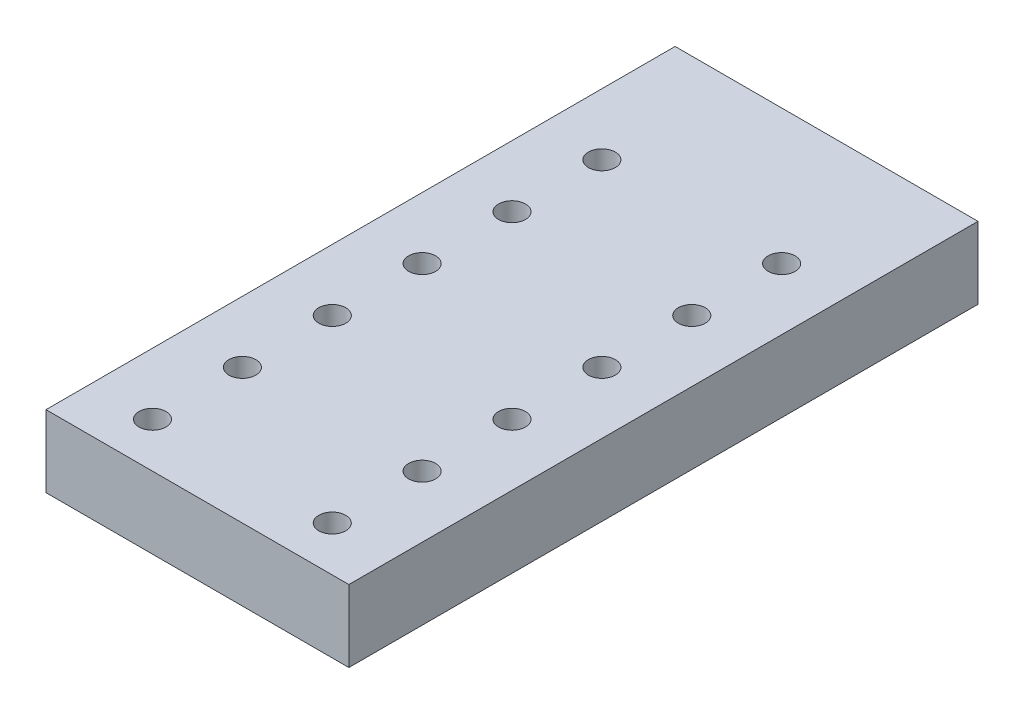
ISO-10303-21;
HEADER;
FILE_DESCRIPTION(('STEP AP214'),'2;1');
FILE_NAME('part.step','',(''),(''),'','','');
FILE_SCHEMA(('AUTOMOTIVE_DESIGN { 1 0 10303 214 1 1 1 1 }'));
ENDSEC;
DATA;
#1=APPLICATION_CONTEXT('core data for automotive mechanical design processes');
#2=APPLICATION_PROTOCOL_DEFINITION('international standard','automotive_design',2000,#1);
#3=PRODUCT_CONTEXT('',#1,'mechanical');
#4=PRODUCT('Part','Part','',(#3));
#5=PRODUCT_RELATED_PRODUCT_CATEGORY('part','',(#4));
#6=PRODUCT_DEFINITION_FORMATION('','',#4);
#7=PRODUCT_DEFINITION_CONTEXT('part definition',#1,'design');
#8=PRODUCT_DEFINITION('design','',#6,#7);
#9=PRODUCT_DEFINITION_SHAPE('','',#8);
#10=(LENGTH_UNIT() NAMED_UNIT(*) SI_UNIT(.MILLI.,.METRE.));
#11=(NAMED_UNIT(*) PLANE_ANGLE_UNIT() SI_UNIT($,.RADIAN.));
#12=(NAMED_UNIT(*) SI_UNIT($,.STERADIAN.) SOLID_ANGLE_UNIT());
#13=UNCERTAINTY_MEASURE_WITH_UNIT(LENGTH_MEASURE(1.E-05),#10,'distance_accuracy_value','');
#14=(GEOMETRIC_REPRESENTATION_CONTEXT(3) GLOBAL_UNCERTAINTY_ASSIGNED_CONTEXT((#13)) GLOBAL_UNIT_ASSIGNED_CONTEXT((#10,
#11,#12)) REPRESENTATION_CONTEXT('',''));
#15=CARTESIAN_POINT('',(0.,0.,0.));
#16=DIRECTION('',(0.,0.,1.));
#17=DIRECTION('',(1.,0.,0.));
#18=AXIS2_PLACEMENT_3D('',#15,#16,#17);
#19=CARTESIAN_POINT('',(10.,4.,65.));
#20=DIRECTION('',(0.,-1.,0.));
#21=DIRECTION('',(0.,0.,-1.));
#22=AXIS2_PLACEMENT_3D('',#19,#20,#21);
#23=CYLINDRICAL_SURFACE('',#22,1.5);
#24=CARTESIAN_POINT('',(10.,4.,65.));
#25=DIRECTION('',(0.,-1.,0.));
#26=DIRECTION('',(0.,0.,-1.));
#27=AXIS2_PLACEMENT_3D('',#24,#25,#26);
#28=CIRCLE('',#27,1.5);
#29=CARTESIAN_POINT('',(10.,4.,63.5));
#30=VERTEX_POINT('',#29);
#31=EDGE_CURVE('E200',#30,#30,#28,.T.);
#32=ORIENTED_EDGE('',*,*,#31,.F.);
#33=EDGE_LOOP('',(#32));
#34=FACE_BOUND('',#33,.T.);
#35=CARTESIAN_POINT('',(10.,0.,65.));
#36=DIRECTION('',(0.,-1.,0.));
#37=DIRECTION('',(0.,0.,-1.));
#38=AXIS2_PLACEMENT_3D('',#35,#36,#37);
#39=CIRCLE('',#38,1.5);
#40=CARTESIAN_POINT('',(10.,0.,63.5));
#41=VERTEX_POINT('',#40);
#42=EDGE_CURVE('E11',#41,#41,#39,.T.);
#43=ORIENTED_EDGE('',*,*,#42,.T.);
#44=EDGE_LOOP('',(#43));
#45=FACE_BOUND('',#44,.T.);
#46=ADVANCED_FACE('F38',(#34,#45),#23,.F.);
#47=CARTESIAN_POINT('',(10.,0.,65.));
#48=DIRECTION('',(0.,-1.,0.));
#49=DIRECTION('',(0.,0.,-1.));
#50=AXIS2_PLACEMENT_3D('',#47,#48,#49);
#51=PLANE('',#50);
#52=ORIENTED_EDGE('',*,*,#42,.F.);
#53=EDGE_LOOP('',(#52));
#54=FACE_BOUND('',#53,.T.);
#55=CARTESIAN_POINT('',(10.,0.,65.));
#56=DIRECTION('',(0.,-1.,0.));
#57=DIRECTION('',(0.,0.,-1.));
#58=AXIS2_PLACEMENT_3D('',#55,#56,#57);
#59=CIRCLE('',#58,2.5);
#60=CARTESIAN_POINT('',(10.,0.,62.5));
#61=VERTEX_POINT('',#60);
#62=EDGE_CURVE('E46',#61,#61,#59,.T.);
#63=ORIENTED_EDGE('',*,*,#62,.T.);
#64=EDGE_LOOP('',(#63));
#65=FACE_BOUND('',#64,.T.);
#66=ADVANCED_FACE('F208',(#54,#65),#51,.T.);
#67=CARTESIAN_POINT('',(10.,0.,65.));
#68=DIRECTION('',(0.,-1.,0.));
#69=DIRECTION('',(0.,0.,-1.));
#70=AXIS2_PLACEMENT_3D('',#67,#68,#69);
#71=CYLINDRICAL_SURFACE('',#70,2.5);
#72=ORIENTED_EDGE('',*,*,#62,.F.);
#73=EDGE_LOOP('',(#72));
#74=FACE_BOUND('',#73,.T.);
#75=CARTESIAN_POINT('',(10.,-4.,65.));
#76=DIRECTION('',(0.,-1.,0.));
#77=DIRECTION('',(0.,0.,-1.));
#78=AXIS2_PLACEMENT_3D('',#75,#76,#77);
#79=CIRCLE('',#78,2.5);
#80=CARTESIAN_POINT('',(10.,-4.,62.5));
#81=VERTEX_POINT('',#80);
#82=EDGE_CURVE('E203',#81,#81,#79,.T.);
#83=ORIENTED_EDGE('',*,*,#82,.T.);
#84=EDGE_LOOP('',(#83));
#85=FACE_BOUND('',#84,.T.);
#86=ADVANCED_FACE('F210',(#74,#85),#71,.F.);
#87=CARTESIAN_POINT('',(10.,4.,55.));
#88=DIRECTION('',(0.,-1.,0.));
#89=DIRECTION('',(0.,0.,-1.));
#90=AXIS2_PLACEMENT_3D('',#87,#88,#89);
#91=CYLINDRICAL_SURFACE('',#90,1.5);
#92=CARTESIAN_POINT('',(10.,4.,55.));
#93=DIRECTION('',(0.,-1.,0.));
#94=DIRECTION('',(0.,0.,-1.));
#95=AXIS2_PLACEMENT_3D('',#92,#93,#94);
#96=CIRCLE('',#95,1.5);
#97=CARTESIAN_POINT('',(10.,4.,53.5));
#98=VERTEX_POINT('',#97);
#99=EDGE_CURVE('E188',#98,#98,#96,.T.);
#100=ORIENTED_EDGE('',*,*,#99,.F.);
#101=EDGE_LOOP('',(#100));
#102=FACE_BOUND('',#101,.T.);
#103=CARTESIAN_POINT('',(10.,0.,55.));
#104=DIRECTION('',(0.,-1.,0.));
#105=DIRECTION('',(0.,0.,-1.));
#106=AXIS2_PLACEMENT_3D('',#103,#104,#105);
#107=CIRCLE('',#106,1.5);
#108=CARTESIAN_POINT('',(10.,0.,53.5));
#109=VERTEX_POINT('',#108);
#110=EDGE_CURVE('E197',#109,#109,#107,.T.);
#111=ORIENTED_EDGE('',*,*,#110,.T.);
#112=EDGE_LOOP('',(#111));
#113=FACE_BOUND('',#112,.T.);
#114=ADVANCED_FACE('F213',(#102,#113),#91,.F.);
#115=CARTESIAN_POINT('',(10.,0.,55.));
#116=DIRECTION('',(0.,-1.,0.));
#117=DIRECTION('',(0.,0.,-1.));
#118=AXIS2_PLACEMENT_3D('',#115,#116,#117);
#119=PLANE('',#118);
#120=ORIENTED_EDGE('',*,*,#110,.F.);
#121=EDGE_LOOP('',(#120));
#122=FACE_BOUND('',#121,.T.);
#123=CARTESIAN_POINT('',(10.,0.,55.));
#124=DIRECTION('',(0.,-1.,0.));
#125=DIRECTION('',(0.,0.,-1.));
#126=AXIS2_PLACEMENT_3D('',#123,#124,#125);
#127=CIRCLE('',#126,2.5);
#128=CARTESIAN_POINT('',(10.,0.,52.5));
#129=VERTEX_POINT('',#128);
#130=EDGE_CURVE('E194',#129,#129,#127,.T.);
#131=ORIENTED_EDGE('',*,*,#130,.T.);
#132=EDGE_LOOP('',(#131));
#133=FACE_BOUND('',#132,.T.);
#134=ADVANCED_FACE('F328',(#122,#133),#119,.T.);
#135=CARTESIAN_POINT('',(10.,0.,55.));
#136=DIRECTION('',(0.,-1.,0.));
#137=DIRECTION('',(0.,0.,-1.));
#138=AXIS2_PLACEMENT_3D('',#135,#136,#137);
#139=CYLINDRICAL_SURFACE('',#138,2.5);
#140=ORIENTED_EDGE('',*,*,#130,.F.);
#141=EDGE_LOOP('',(#140));
#142=FACE_BOUND('',#141,.T.);
#143=CARTESIAN_POINT('',(10.,-4.,55.));
#144=DIRECTION('',(0.,-1.,0.));
#145=DIRECTION('',(0.,0.,-1.));
#146=AXIS2_PLACEMENT_3D('',#143,#144,#145);
#147=CIRCLE('',#146,2.5);
#148=CARTESIAN_POINT('',(10.,-4.,52.5));
#149=VERTEX_POINT('',#148);
#150=EDGE_CURVE('E191',#149,#149,#147,.T.);
#151=ORIENTED_EDGE('',*,*,#150,.T.);
#152=EDGE_LOOP('',(#151));
#153=FACE_BOUND('',#152,.T.);
#154=ADVANCED_FACE('F324',(#142,#153),#139,.F.);
#155=CARTESIAN_POINT('',(10.,4.,45.));
#156=DIRECTION('',(0.,-1.,0.));
#157=DIRECTION('',(0.,0.,-1.));
#158=AXIS2_PLACEMENT_3D('',#155,#156,#157);
#159=CYLINDRICAL_SURFACE('',#158,1.5);
#160=CARTESIAN_POINT('',(10.,4.,45.));
#161=DIRECTION('',(0.,-1.,0.));
#162=DIRECTION('',(0.,0.,-1.));
#163=AXIS2_PLACEMENT_3D('',#160,#161,#162);
#164=CIRCLE('',#163,1.5);
#165=CARTESIAN_POINT('',(10.,4.,43.5));
#166=VERTEX_POINT('',#165);
#167=EDGE_CURVE('E176',#166,#166,#164,.T.);
#168=ORIENTED_EDGE('',*,*,#167,.F.);
#169=EDGE_LOOP('',(#168));
#170=FACE_BOUND('',#169,.T.);
#171=CARTESIAN_POINT('',(10.,0.,45.));
#172=DIRECTION('',(0.,-1.,0.));
#173=DIRECTION('',(0.,0.,-1.));
#174=AXIS2_PLACEMENT_3D('',#171,#172,#173);
#175=CIRCLE('',#174,1.5);
#176=CARTESIAN_POINT('',(10.,0.,43.5));
#177=VERTEX_POINT('',#176);
#178=EDGE_CURVE('E185',#177,#177,#175,.T.);
#179=ORIENTED_EDGE('',*,*,#178,.T.);
#180=EDGE_LOOP('',(#179));
#181=FACE_BOUND('',#180,.T.);
#182=ADVANCED_FACE('F320',(#170,#181),#159,.F.);
#183=CARTESIAN_POINT('',(10.,0.,45.));
#184=DIRECTION('',(0.,-1.,0.));
#185=DIRECTION('',(0.,0.,-1.));
#186=AXIS2_PLACEMENT_3D('',#183,#184,#185);
#187=PLANE('',#186);
#188=ORIENTED_EDGE('',*,*,#178,.F.);
#189=EDGE_LOOP('',(#188));
#190=FACE_BOUND('',#189,.T.);
#191=CARTESIAN_POINT('',(10.,0.,45.));
#192=DIRECTION('',(0.,-1.,0.));
#193=DIRECTION('',(0.,0.,-1.));
#194=AXIS2_PLACEMENT_3D('',#191,#192,#193);
#195=CIRCLE('',#194,2.5);
#196=CARTESIAN_POINT('',(10.,0.,42.5));
#197=VERTEX_POINT('',#196);
#198=EDGE_CURVE('E182',#197,#197,#195,.T.);
#199=ORIENTED_EDGE('',*,*,#198,.T.);
#200=EDGE_LOOP('',(#199));
#201=FACE_BOUND('',#200,.T.);
#202=ADVANCED_FACE('F316',(#190,#201),#187,.T.);
#203=CARTESIAN_POINT('',(10.,0.,45.));
#204=DIRECTION('',(0.,-1.,0.));
#205=DIRECTION('',(0.,0.,-1.));
#206=AXIS2_PLACEMENT_3D('',#203,#204,#205);
#207=CYLINDRICAL_SURFACE('',#206,2.5);
#208=ORIENTED_EDGE('',*,*,#198,.F.);
#209=EDGE_LOOP('',(#208));
#210=FACE_BOUND('',#209,.T.);
#211=CARTESIAN_POINT('',(10.,-4.,45.));
#212=DIRECTION('',(0.,-1.,0.));
#213=DIRECTION('',(0.,0.,-1.));
#214=AXIS2_PLACEMENT_3D('',#211,#212,#213);
#215=CIRCLE('',#214,2.5);
#216=CARTESIAN_POINT('',(10.,-4.,42.5));
#217=VERTEX_POINT('',#216);
#218=EDGE_CURVE('E179',#217,#217,#215,.T.);
#219=ORIENTED_EDGE('',*,*,#218,.T.);
#220=EDGE_LOOP('',(#219));
#221=FACE_BOUND('',#220,.T.);
#222=ADVANCED_FACE('F312',(#210,#221),#207,.F.);
#223=CARTESIAN_POINT('',(10.,4.,35.));
#224=DIRECTION('',(0.,-1.,0.));
#225=DIRECTION('',(0.,0.,-1.));
#226=AXIS2_PLACEMENT_3D('',#223,#224,#225);
#227=CYLINDRICAL_SURFACE('',#226,1.5);
#228=CARTESIAN_POINT('',(10.,4.,35.));
#229=DIRECTION('',(0.,-1.,0.));
#230=DIRECTION('',(0.,0.,-1.));
#231=AXIS2_PLACEMENT_3D('',#228,#229,#230);
#232=CIRCLE('',#231,1.5);
#233=CARTESIAN_POINT('',(10.,4.,33.5));
#234=VERTEX_POINT('',#233);
#235=EDGE_CURVE('E164',#234,#234,#232,.T.);
#236=ORIENTED_EDGE('',*,*,#235,.F.);
#237=EDGE_LOOP('',(#236));
#238=FACE_BOUND('',#237,.T.);
#239=CARTESIAN_POINT('',(10.,0.,35.));
#240=DIRECTION('',(0.,-1.,0.));
#241=DIRECTION('',(0.,0.,-1.));
#242=AXIS2_PLACEMENT_3D('',#239,#240,#241);
#243=CIRCLE('',#242,1.5);
#244=CARTESIAN_POINT('',(10.,0.,33.5));
#245=VERTEX_POINT('',#244);
#246=EDGE_CURVE('E173',#245,#245,#243,.T.);
#247=ORIENTED_EDGE('',*,*,#246,.T.);
#248=EDGE_LOOP('',(#247));
#249=FACE_BOUND('',#248,.T.);
#250=ADVANCED_FACE('F308',(#238,#249),#227,.F.);
#251=CARTESIAN_POINT('',(10.,0.,35.));
#252=DIRECTION('',(0.,-1.,0.));
#253=DIRECTION('',(0.,0.,-1.));
#254=AXIS2_PLACEMENT_3D('',#251,#252,#253);
#255=PLANE('',#254);
#256=ORIENTED_EDGE('',*,*,#246,.F.);
#257=EDGE_LOOP('',(#256));
#258=FACE_BOUND('',#257,.T.);
#259=CARTESIAN_POINT('',(10.,0.,35.));
#260=DIRECTION('',(0.,-1.,0.));
#261=DIRECTION('',(0.,0.,-1.));
#262=AXIS2_PLACEMENT_3D('',#259,#260,#261);
#263=CIRCLE('',#262,2.5);
#264=CARTESIAN_POINT('',(10.,0.,32.5));
#265=VERTEX_POINT('',#264);
#266=EDGE_CURVE('E170',#265,#265,#263,.T.);
#267=ORIENTED_EDGE('',*,*,#266,.T.);
#268=EDGE_LOOP('',(#267));
#269=FACE_BOUND('',#268,.T.);
#270=ADVANCED_FACE('F304',(#258,#269),#255,.T.);
#271=CARTESIAN_POINT('',(10.,0.,35.));
#272=DIRECTION('',(0.,-1.,0.));
#273=DIRECTION('',(0.,0.,-1.));
#274=AXIS2_PLACEMENT_3D('',#271,#272,#273);
#275=CYLINDRICAL_SURFACE('',#274,2.5);
#276=ORIENTED_EDGE('',*,*,#266,.F.);
#277=EDGE_LOOP('',(#276));
#278=FACE_BOUND('',#277,.T.);
#279=CARTESIAN_POINT('',(10.,-4.,35.));
#280=DIRECTION('',(0.,-1.,0.));
#281=DIRECTION('',(0.,0.,-1.));
#282=AXIS2_PLACEMENT_3D('',#279,#280,#281);
#283=CIRCLE('',#282,2.5);
#284=CARTESIAN_POINT('',(10.,-4.,32.5));
#285=VERTEX_POINT('',#284);
#286=EDGE_CURVE('E167',#285,#285,#283,.T.);
#287=ORIENTED_EDGE('',*,*,#286,.T.);
#288=EDGE_LOOP('',(#287));
#289=FACE_BOUND('',#288,.T.);
#290=ADVANCED_FACE('F300',(#278,#289),#275,.F.);
#291=CARTESIAN_POINT('',(-10.,4.,65.));
#292=DIRECTION('',(0.,-1.,0.));
#293=DIRECTION('',(0.,0.,-1.));
#294=AXIS2_PLACEMENT_3D('',#291,#292,#293);
#295=CYLINDRICAL_SURFACE('',#294,1.5);
#296=CARTESIAN_POINT('',(-10.,4.,65.));
#297=DIRECTION('',(0.,-1.,0.));
#298=DIRECTION('',(0.,0.,-1.));
#299=AXIS2_PLACEMENT_3D('',#296,#297,#298);
#300=CIRCLE('',#299,1.5);
#301=CARTESIAN_POINT('',(-10.,4.,63.5));
#302=VERTEX_POINT('',#301);
#303=EDGE_CURVE('E152',#302,#302,#300,.T.);
#304=ORIENTED_EDGE('',*,*,#303,.F.);
#305=EDGE_LOOP('',(#304));
#306=FACE_BOUND('',#305,.T.);
#307=CARTESIAN_POINT('',(-10.,0.,65.));
#308=DIRECTION('',(0.,-1.,0.));
#309=DIRECTION('',(0.,0.,-1.));
#310=AXIS2_PLACEMENT_3D('',#307,#308,#309);
#311=CIRCLE('',#310,1.5);
#312=CARTESIAN_POINT('',(-10.,0.,63.5));
#313=VERTEX_POINT('',#312);
#314=EDGE_CURVE('E161',#313,#313,#311,.T.);
#315=ORIENTED_EDGE('',*,*,#314,.T.);
#316=EDGE_LOOP('',(#315));
#317=FACE_BOUND('',#316,.T.);
#318=ADVANCED_FACE('F296',(#306,#317),#295,.F.);
#319=CARTESIAN_POINT('',(-10.,0.,65.));
#320=DIRECTION('',(0.,-1.,0.));
#321=DIRECTION('',(0.,0.,-1.));
#322=AXIS2_PLACEMENT_3D('',#319,#320,#321);
#323=PLANE('',#322);
#324=ORIENTED_EDGE('',*,*,#314,.F.);
#325=EDGE_LOOP('',(#324));
#326=FACE_BOUND('',#325,.T.);
#327=CARTESIAN_POINT('',(-10.,0.,65.));
#328=DIRECTION('',(0.,-1.,0.));
#329=DIRECTION('',(0.,0.,-1.));
#330=AXIS2_PLACEMENT_3D('',#327,#328,#329);
#331=CIRCLE('',#330,2.5);
#332=CARTESIAN_POINT('',(-10.,0.,62.5));
#333=VERTEX_POINT('',#332);
#334=EDGE_CURVE('E158',#333,#333,#331,.T.);
#335=ORIENTED_EDGE('',*,*,#334,.T.);
#336=EDGE_LOOP('',(#335));
#337=FACE_BOUND('',#336,.T.);
#338=ADVANCED_FACE('F292',(#326,#337),#323,.T.);
#339=CARTESIAN_POINT('',(-10.,0.,65.));
#340=DIRECTION('',(0.,-1.,0.));
#341=DIRECTION('',(0.,0.,-1.));
#342=AXIS2_PLACEMENT_3D('',#339,#340,#341);
#343=CYLINDRICAL_SURFACE('',#342,2.5);
#344=ORIENTED_EDGE('',*,*,#334,.F.);
#345=EDGE_LOOP('',(#344));
#346=FACE_BOUND('',#345,.T.);
#347=CARTESIAN_POINT('',(-10.,-4.,65.));
#348=DIRECTION('',(0.,-1.,0.));
#349=DIRECTION('',(0.,0.,-1.));
#350=AXIS2_PLACEMENT_3D('',#347,#348,#349);
#351=CIRCLE('',#350,2.5);
#352=CARTESIAN_POINT('',(-10.,-4.,62.5));
#353=VERTEX_POINT('',#352);
#354=EDGE_CURVE('E155',#353,#353,#351,.T.);
#355=ORIENTED_EDGE('',*,*,#354,.T.);
#356=EDGE_LOOP('',(#355));
#357=FACE_BOUND('',#356,.T.);
#358=ADVANCED_FACE('F288',(#346,#357),#343,.F.);
#359=CARTESIAN_POINT('',(-10.,4.,55.));
#360=DIRECTION('',(0.,-1.,0.));
#361=DIRECTION('',(0.,0.,-1.));
#362=AXIS2_PLACEMENT_3D('',#359,#360,#361);
#363=CYLINDRICAL_SURFACE('',#362,1.5);
#364=CARTESIAN_POINT('',(-10.,4.,55.));
#365=DIRECTION('',(0.,-1.,0.));
#366=DIRECTION('',(0.,0.,-1.));
#367=AXIS2_PLACEMENT_3D('',#364,#365,#366);
#368=CIRCLE('',#367,1.5);
#369=CARTESIAN_POINT('',(-10.,4.,53.5));
#370=VERTEX_POINT('',#369);
#371=EDGE_CURVE('E140',#370,#370,#368,.T.);
#372=ORIENTED_EDGE('',*,*,#371,.F.);
#373=EDGE_LOOP('',(#372));
#374=FACE_BOUND('',#373,.T.);
#375=CARTESIAN_POINT('',(-10.,0.,55.));
#376=DIRECTION('',(0.,-1.,0.));
#377=DIRECTION('',(0.,0.,-1.));
#378=AXIS2_PLACEMENT_3D('',#375,#376,#377);
#379=CIRCLE('',#378,1.5);
#380=CARTESIAN_POINT('',(-10.,0.,53.5));
#381=VERTEX_POINT('',#380);
#382=EDGE_CURVE('E149',#381,#381,#379,.T.);
#383=ORIENTED_EDGE('',*,*,#382,.T.);
#384=EDGE_LOOP('',(#383));
#385=FACE_BOUND('',#384,.T.);
#386=ADVANCED_FACE('F284',(#374,#385),#363,.F.);
#387=CARTESIAN_POINT('',(-10.,0.,55.));
#388=DIRECTION('',(0.,-1.,0.));
#389=DIRECTION('',(0.,0.,-1.));
#390=AXIS2_PLACEMENT_3D('',#387,#388,#389);
#391=PLANE('',#390);
#392=ORIENTED_EDGE('',*,*,#382,.F.);
#393=EDGE_LOOP('',(#392));
#394=FACE_BOUND('',#393,.T.);
#395=CARTESIAN_POINT('',(-10.,0.,55.));
#396=DIRECTION('',(0.,-1.,0.));
#397=DIRECTION('',(0.,0.,-1.));
#398=AXIS2_PLACEMENT_3D('',#395,#396,#397);
#399=CIRCLE('',#398,2.5);
#400=CARTESIAN_POINT('',(-10.,0.,52.5));
#401=VERTEX_POINT('',#400);
#402=EDGE_CURVE('E146',#401,#401,#399,.T.);
#403=ORIENTED_EDGE('',*,*,#402,.T.);
#404=EDGE_LOOP('',(#403));
#405=FACE_BOUND('',#404,.T.);
#406=ADVANCED_FACE('F280',(#394,#405),#391,.T.);
#407=CARTESIAN_POINT('',(-10.,0.,55.));
#408=DIRECTION('',(0.,-1.,0.));
#409=DIRECTION('',(0.,0.,-1.));
#410=AXIS2_PLACEMENT_3D('',#407,#408,#409);
#411=CYLINDRICAL_SURFACE('',#410,2.5);
#412=ORIENTED_EDGE('',*,*,#402,.F.);
#413=EDGE_LOOP('',(#412));
#414=FACE_BOUND('',#413,.T.);
#415=CARTESIAN_POINT('',(-10.,-4.,55.));
#416=DIRECTION('',(0.,-1.,0.));
#417=DIRECTION('',(0.,0.,-1.));
#418=AXIS2_PLACEMENT_3D('',#415,#416,#417);
#419=CIRCLE('',#418,2.5);
#420=CARTESIAN_POINT('',(-10.,-4.,52.5));
#421=VERTEX_POINT('',#420);
#422=EDGE_CURVE('E143',#421,#421,#419,.T.);
#423=ORIENTED_EDGE('',*,*,#422,.T.);
#424=EDGE_LOOP('',(#423));
#425=FACE_BOUND('',#424,.T.);
#426=ADVANCED_FACE('F276',(#414,#425),#411,.F.);
#427=CARTESIAN_POINT('',(-10.,4.,45.));
#428=DIRECTION('',(0.,-1.,0.));
#429=DIRECTION('',(0.,0.,-1.));
#430=AXIS2_PLACEMENT_3D('',#427,#428,#429);
#431=CYLINDRICAL_SURFACE('',#430,1.5);
#432=CARTESIAN_POINT('',(-10.,4.,45.));
#433=DIRECTION('',(0.,-1.,0.));
#434=DIRECTION('',(0.,0.,-1.));
#435=AXIS2_PLACEMENT_3D('',#432,#433,#434);
#436=CIRCLE('',#435,1.5);
#437=CARTESIAN_POINT('',(-10.,4.,43.5));
#438=VERTEX_POINT('',#437);
#439=EDGE_CURVE('E128',#438,#438,#436,.T.);
#440=ORIENTED_EDGE('',*,*,#439,.F.);
#441=EDGE_LOOP('',(#440));
#442=FACE_BOUND('',#441,.T.);
#443=CARTESIAN_POINT('',(-10.,0.,45.));
#444=DIRECTION('',(0.,-1.,0.));
#445=DIRECTION('',(0.,0.,-1.));
#446=AXIS2_PLACEMENT_3D('',#443,#444,#445);
#447=CIRCLE('',#446,1.5);
#448=CARTESIAN_POINT('',(-10.,0.,43.5));
#449=VERTEX_POINT('',#448);
#450=EDGE_CURVE('E137',#449,#449,#447,.T.);
#451=ORIENTED_EDGE('',*,*,#450,.T.);
#452=EDGE_LOOP('',(#451));
#453=FACE_BOUND('',#452,.T.);
#454=ADVANCED_FACE('F272',(#442,#453),#431,.F.);
#455=CARTESIAN_POINT('',(-10.,0.,45.));
#456=DIRECTION('',(0.,-1.,0.));
#457=DIRECTION('',(0.,0.,-1.));
#458=AXIS2_PLACEMENT_3D('',#455,#456,#457);
#459=PLANE('',#458);
#460=ORIENTED_EDGE('',*,*,#450,.F.);
#461=EDGE_LOOP('',(#460));
#462=FACE_BOUND('',#461,.T.);
#463=CARTESIAN_POINT('',(-10.,0.,45.));
#464=DIRECTION('',(0.,-1.,0.));
#465=DIRECTION('',(0.,0.,-1.));
#466=AXIS2_PLACEMENT_3D('',#463,#464,#465);
#467=CIRCLE('',#466,2.5);
#468=CARTESIAN_POINT('',(-10.,0.,42.5));
#469=VERTEX_POINT('',#468);
#470=EDGE_CURVE('E134',#469,#469,#467,.T.);
#471=ORIENTED_EDGE('',*,*,#470,.T.);
#472=EDGE_LOOP('',(#471));
#473=FACE_BOUND('',#472,.T.);
#474=ADVANCED_FACE('F268',(#462,#473),#459,.T.);
#475=CARTESIAN_POINT('',(-10.,0.,45.));
#476=DIRECTION('',(0.,-1.,0.));
#477=DIRECTION('',(0.,0.,-1.));
#478=AXIS2_PLACEMENT_3D('',#475,#476,#477);
#479=CYLINDRICAL_SURFACE('',#478,2.5);
#480=ORIENTED_EDGE('',*,*,#470,.F.);
#481=EDGE_LOOP('',(#480));
#482=FACE_BOUND('',#481,.T.);
#483=CARTESIAN_POINT('',(-10.,-4.,45.));
#484=DIRECTION('',(0.,-1.,0.));
#485=DIRECTION('',(0.,0.,-1.));
#486=AXIS2_PLACEMENT_3D('',#483,#484,#485);
#487=CIRCLE('',#486,2.5);
#488=CARTESIAN_POINT('',(-10.,-4.,42.5));
#489=VERTEX_POINT('',#488);
#490=EDGE_CURVE('E131',#489,#489,#487,.T.);
#491=ORIENTED_EDGE('',*,*,#490,.T.);
#492=EDGE_LOOP('',(#491));
#493=FACE_BOUND('',#492,.T.);
#494=ADVANCED_FACE('F264',(#482,#493),#479,.F.);
#495=CARTESIAN_POINT('',(-10.,4.,35.));
#496=DIRECTION('',(0.,-1.,0.));
#497=DIRECTION('',(0.,0.,-1.));
#498=AXIS2_PLACEMENT_3D('',#495,#496,#497);
#499=CYLINDRICAL_SURFACE('',#498,1.5);
#500=CARTESIAN_POINT('',(-10.,4.,35.));
#501=DIRECTION('',(0.,-1.,0.));
#502=DIRECTION('',(0.,0.,-1.));
#503=AXIS2_PLACEMENT_3D('',#500,#501,#502);
#504=CIRCLE('',#503,1.5);
#505=CARTESIAN_POINT('',(-10.,4.,33.5));
#506=VERTEX_POINT('',#505);
#507=EDGE_CURVE('E116',#506,#506,#504,.T.);
#508=ORIENTED_EDGE('',*,*,#507,.F.);
#509=EDGE_LOOP('',(#508));
#510=FACE_BOUND('',#509,.T.);
#511=CARTESIAN_POINT('',(-10.,0.,35.));
#512=DIRECTION('',(0.,-1.,0.));
#513=DIRECTION('',(0.,0.,-1.));
#514=AXIS2_PLACEMENT_3D('',#511,#512,#513);
#515=CIRCLE('',#514,1.5);
#516=CARTESIAN_POINT('',(-10.,0.,33.5));
#517=VERTEX_POINT('',#516);
#518=EDGE_CURVE('E125',#517,#517,#515,.T.);
#519=ORIENTED_EDGE('',*,*,#518,.T.);
#520=EDGE_LOOP('',(#519));
#521=FACE_BOUND('',#520,.T.);
#522=ADVANCED_FACE('F260',(#510,#521),#499,.F.);
#523=CARTESIAN_POINT('',(-10.,0.,35.));
#524=DIRECTION('',(0.,-1.,0.));
#525=DIRECTION('',(0.,0.,-1.));
#526=AXIS2_PLACEMENT_3D('',#523,#524,#525);
#527=PLANE('',#526);
#528=ORIENTED_EDGE('',*,*,#518,.F.);
#529=EDGE_LOOP('',(#528));
#530=FACE_BOUND('',#529,.T.);
#531=CARTESIAN_POINT('',(-10.,0.,35.));
#532=DIRECTION('',(0.,-1.,0.));
#533=DIRECTION('',(0.,0.,-1.));
#534=AXIS2_PLACEMENT_3D('',#531,#532,#533);
#535=CIRCLE('',#534,2.5);
#536=CARTESIAN_POINT('',(-10.,0.,32.5));
#537=VERTEX_POINT('',#536);
#538=EDGE_CURVE('E122',#537,#537,#535,.T.);
#539=ORIENTED_EDGE('',*,*,#538,.T.);
#540=EDGE_LOOP('',(#539));
#541=FACE_BOUND('',#540,.T.);
#542=ADVANCED_FACE('F256',(#530,#541),#527,.T.);
#543=CARTESIAN_POINT('',(-10.,0.,35.));
#544=DIRECTION('',(0.,-1.,0.));
#545=DIRECTION('',(0.,0.,-1.));
#546=AXIS2_PLACEMENT_3D('',#543,#544,#545);
#547=CYLINDRICAL_SURFACE('',#546,2.5);
#548=ORIENTED_EDGE('',*,*,#538,.F.);
#549=EDGE_LOOP('',(#548));
#550=FACE_BOUND('',#549,.T.);
#551=CARTESIAN_POINT('',(-10.,-4.,35.));
#552=DIRECTION('',(0.,-1.,0.));
#553=DIRECTION('',(0.,0.,-1.));
#554=AXIS2_PLACEMENT_3D('',#551,#552,#553);
#555=CIRCLE('',#554,2.5);
#556=CARTESIAN_POINT('',(-10.,-4.,32.5));
#557=VERTEX_POINT('',#556);
#558=EDGE_CURVE('E119',#557,#557,#555,.T.);
#559=ORIENTED_EDGE('',*,*,#558,.T.);
#560=EDGE_LOOP('',(#559));
#561=FACE_BOUND('',#560,.T.);
#562=ADVANCED_FACE('F248',(#550,#561),#547,.F.);
#563=CARTESIAN_POINT('',(16.85,-4.,70.));
#564=DIRECTION('',(-1.,0.,0.));
#565=DIRECTION('',(0.,0.,1.));
#566=AXIS2_PLACEMENT_3D('',#563,#564,#565);
#567=PLANE('',#566);
#568=DIRECTION('',(0.,1.,0.));
#569=VECTOR('',#568,1.);
#570=CARTESIAN_POINT('',(16.85,-4.,0.));
#571=LINE('',#570,#569);
#572=CARTESIAN_POINT('',(16.85,-4.,0.));
#573=VERTEX_POINT('',#572);
#574=CARTESIAN_POINT('',(16.85,4.,0.));
#575=VERTEX_POINT('',#574);
#576=EDGE_CURVE('E106',#573,#575,#571,.T.);
#577=ORIENTED_EDGE('',*,*,#576,.T.);
#578=DIRECTION('',(0.,0.,-1.));
#579=VECTOR('',#578,1.);
#580=CARTESIAN_POINT('',(16.85,4.,70.));
#581=LINE('',#580,#579);
#582=CARTESIAN_POINT('',(16.85,4.,70.));
#583=VERTEX_POINT('',#582);
#584=EDGE_CURVE('E97',#583,#575,#581,.T.);
#585=ORIENTED_EDGE('',*,*,#584,.F.);
#586=DIRECTION('',(0.,1.,0.));
#587=VECTOR('',#586,1.);
#588=CARTESIAN_POINT('',(16.85,-4.,70.));
#589=LINE('',#588,#587);
#590=CARTESIAN_POINT('',(16.85,-4.,70.));
#591=VERTEX_POINT('',#590);
#592=EDGE_CURVE('E90',#591,#583,#589,.T.);
#593=ORIENTED_EDGE('',*,*,#592,.F.);
#594=DIRECTION('',(0.,0.,-1.));
#595=VECTOR('',#594,1.);
#596=CARTESIAN_POINT('',(16.85,-4.,70.));
#597=LINE('',#596,#595);
#598=EDGE_CURVE('E102',#591,#573,#597,.T.);
#599=ORIENTED_EDGE('',*,*,#598,.T.);
#600=EDGE_LOOP('',(#577,#585,#593,#599));
#601=FACE_BOUND('',#600,.T.);
#602=ADVANCED_FACE('F242',(#601),#567,.F.);
#603=CARTESIAN_POINT('',(-16.85,4.,70.));
#604=DIRECTION('',(0.,-1.,0.));
#605=DIRECTION('',(0.,0.,-1.));
#606=AXIS2_PLACEMENT_3D('',#603,#604,#605);
#607=PLANE('',#606);
#608=CARTESIAN_POINT('',(10.,4.,25.));
#609=DIRECTION('',(0.,-1.,0.));
#610=DIRECTION('',(0.,0.,-1.));
#611=AXIS2_PLACEMENT_3D('',#608,#609,#610);
#612=CIRCLE('',#611,1.5);
#613=CARTESIAN_POINT('',(10.,4.,23.5));
#614=VERTEX_POINT('',#613);
#615=EDGE_CURVE('E676',#614,#614,#612,.T.);
#616=ORIENTED_EDGE('',*,*,#615,.T.);
#617=EDGE_LOOP('',(#616));
#618=FACE_BOUND('',#617,.T.);
#619=CARTESIAN_POINT('',(-10.,4.,25.));
#620=DIRECTION('',(0.,-1.,0.));
#621=DIRECTION('',(0.,0.,-1.));
#622=AXIS2_PLACEMENT_3D('',#619,#620,#621);
#623=CIRCLE('',#622,1.5);
#624=CARTESIAN_POINT('',(-10.,4.,23.5));
#625=VERTEX_POINT('',#624);
#626=EDGE_CURVE('E684',#625,#625,#623,.T.);
#627=ORIENTED_EDGE('',*,*,#626,.T.);
#628=EDGE_LOOP('',(#627));
#629=FACE_BOUND('',#628,.T.);
#630=CARTESIAN_POINT('',(-10.,4.,15.));
#631=DIRECTION('',(0.,-1.,0.));
#632=DIRECTION('',(0.,0.,-1.));
#633=AXIS2_PLACEMENT_3D('',#630,#631,#632);
#634=CIRCLE('',#633,1.5);
#635=CARTESIAN_POINT('',(-10.,4.,13.5));
#636=VERTEX_POINT('',#635);
#637=EDGE_CURVE('E702',#636,#636,#634,.T.);
#638=ORIENTED_EDGE('',*,*,#637,.T.);
#639=EDGE_LOOP('',(#638));
#640=FACE_BOUND('',#639,.T.);
#641=CARTESIAN_POINT('',(10.,4.,15.));
#642=DIRECTION('',(0.,-1.,0.));
#643=DIRECTION('',(0.,0.,-1.));
#644=AXIS2_PLACEMENT_3D('',#641,#642,#643);
#645=CIRCLE('',#644,1.5);
#646=CARTESIAN_POINT('',(10.,4.,13.5));
#647=VERTEX_POINT('',#646);
#648=EDGE_CURVE('E709',#647,#647,#645,.T.);
#649=ORIENTED_EDGE('',*,*,#648,.T.);
#650=EDGE_LOOP('',(#649));
#651=FACE_BOUND('',#650,.T.);
#652=DIRECTION('',(-1.,0.,0.));
#653=VECTOR('',#652,1.);
#654=CARTESIAN_POINT('',(-16.85,4.,0.));
#655=LINE('',#654,#653);
#656=CARTESIAN_POINT('',(-16.85,4.,0.));
#657=VERTEX_POINT('',#656);
#658=EDGE_CURVE('E96',#575,#657,#655,.T.);
#659=ORIENTED_EDGE('',*,*,#658,.T.);
#660=DIRECTION('',(0.,0.,-1.));
#661=VECTOR('',#660,1.);
#662=CARTESIAN_POINT('',(-16.85,4.,70.));
#663=LINE('',#662,#661);
#664=CARTESIAN_POINT('',(-16.85,4.,70.));
#665=VERTEX_POINT('',#664);
#666=EDGE_CURVE('E93',#665,#657,#663,.T.);
#667=ORIENTED_EDGE('',*,*,#666,.F.);
#668=DIRECTION('',(-1.,0.,0.));
#669=VECTOR('',#668,1.);
#670=CARTESIAN_POINT('',(-16.85,4.,70.));
#671=LINE('',#670,#669);
#672=EDGE_CURVE('E85',#583,#665,#671,.T.);
#673=ORIENTED_EDGE('',*,*,#672,.F.);
#674=ORIENTED_EDGE('',*,*,#584,.T.);
#675=EDGE_LOOP('',(#659,#667,#673,#674));
#676=FACE_BOUND('',#675,.T.);
#677=ORIENTED_EDGE('',*,*,#507,.T.);
#678=EDGE_LOOP('',(#677));
#679=FACE_BOUND('',#678,.T.);
#680=ORIENTED_EDGE('',*,*,#439,.T.);
#681=EDGE_LOOP('',(#680));
#682=FACE_BOUND('',#681,.T.);
#683=ORIENTED_EDGE('',*,*,#371,.T.);
#684=EDGE_LOOP('',(#683));
#685=FACE_BOUND('',#684,.T.);
#686=ORIENTED_EDGE('',*,*,#303,.T.);
#687=EDGE_LOOP('',(#686));
#688=FACE_BOUND('',#687,.T.);
#689=ORIENTED_EDGE('',*,*,#235,.T.);
#690=EDGE_LOOP('',(#689));
#691=FACE_BOUND('',#690,.T.);
#692=ORIENTED_EDGE('',*,*,#167,.T.);
#693=EDGE_LOOP('',(#692));
#694=FACE_BOUND('',#693,.T.);
#695=ORIENTED_EDGE('',*,*,#99,.T.);
#696=EDGE_LOOP('',(#695));
#697=FACE_BOUND('',#696,.T.);
#698=ORIENTED_EDGE('',*,*,#31,.T.);
#699=EDGE_LOOP('',(#698));
#700=FACE_BOUND('',#699,.T.);
#701=ADVANCED_FACE('F94',(#618,#629,#640,#651,#676,#679,#682,#685,#688,#691,#694,#697,#700),
#607,.F.);
#702=CARTESIAN_POINT('',(-16.85,-4.,70.));
#703=DIRECTION('',(1.,0.,0.));
#704=DIRECTION('',(0.,0.,-1.));
#705=AXIS2_PLACEMENT_3D('',#702,#703,#704);
#706=PLANE('',#705);
#707=DIRECTION('',(0.,-1.,0.));
#708=VECTOR('',#707,1.);
#709=CARTESIAN_POINT('',(-16.85,-4.,0.));
#710=LINE('',#709,#708);
#711=CARTESIAN_POINT('',(-16.85,-4.,0.));
#712=VERTEX_POINT('',#711);
#713=EDGE_CURVE('E71',#657,#712,#710,.T.);
#714=ORIENTED_EDGE('',*,*,#713,.T.);
#715=DIRECTION('',(0.,0.,-1.));
#716=VECTOR('',#715,1.);
#717=CARTESIAN_POINT('',(-16.85,-4.,70.));
#718=LINE('',#717,#716);
#719=CARTESIAN_POINT('',(-16.85,-4.,70.));
#720=VERTEX_POINT('',#719);
#721=EDGE_CURVE('E98',#720,#712,#718,.T.);
#722=ORIENTED_EDGE('',*,*,#721,.F.);
#723=DIRECTION('',(0.,-1.,0.));
#724=VECTOR('',#723,1.);
#725=CARTESIAN_POINT('',(-16.85,-4.,70.));
#726=LINE('',#725,#724);
#727=EDGE_CURVE('E88',#665,#720,#726,.T.);
#728=ORIENTED_EDGE('',*,*,#727,.F.);
#729=ORIENTED_EDGE('',*,*,#666,.T.);
#730=EDGE_LOOP('',(#714,#722,#728,#729));
#731=FACE_BOUND('',#730,.T.);
#732=ADVANCED_FACE('F100',(#731),#706,.F.);
#733=CARTESIAN_POINT('',(-16.85,-4.,70.));
#734=DIRECTION('',(0.,1.,0.));
#735=DIRECTION('',(0.,0.,1.));
#736=AXIS2_PLACEMENT_3D('',#733,#734,#735);
#737=PLANE('',#736);
#738=CARTESIAN_POINT('',(10.,-4.,25.));
#739=DIRECTION('',(0.,-1.,0.));
#740=DIRECTION('',(0.,0.,-1.));
#741=AXIS2_PLACEMENT_3D('',#738,#739,#740);
#742=CIRCLE('',#741,2.5);
#743=CARTESIAN_POINT('',(10.,-4.,22.5));
#744=VERTEX_POINT('',#743);
#745=EDGE_CURVE('E681',#744,#744,#742,.T.);
#746=ORIENTED_EDGE('',*,*,#745,.F.);
#747=EDGE_LOOP('',(#746));
#748=FACE_BOUND('',#747,.T.);
#749=CARTESIAN_POINT('',(-10.,-4.,25.));
#750=DIRECTION('',(0.,-1.,0.));
#751=DIRECTION('',(0.,0.,-1.));
#752=AXIS2_PLACEMENT_3D('',#749,#750,#751);
#753=CIRCLE('',#752,2.5);
#754=CARTESIAN_POINT('',(-10.,-4.,22.5));
#755=VERTEX_POINT('',#754);
#756=EDGE_CURVE('E692',#755,#755,#753,.T.);
#757=ORIENTED_EDGE('',*,*,#756,.F.);
#758=EDGE_LOOP('',(#757));
#759=FACE_BOUND('',#758,.T.);
#760=CARTESIAN_POINT('',(-10.,-4.,15.));
#761=DIRECTION('',(0.,-1.,0.));
#762=DIRECTION('',(0.,0.,-1.));
#763=AXIS2_PLACEMENT_3D('',#760,#761,#762);
#764=CIRCLE('',#763,2.5);
#765=CARTESIAN_POINT('',(-10.,-4.,12.5));
#766=VERTEX_POINT('',#765);
#767=EDGE_CURVE('E718',#766,#766,#764,.T.);
#768=ORIENTED_EDGE('',*,*,#767,.F.);
#769=EDGE_LOOP('',(#768));
#770=FACE_BOUND('',#769,.T.);
#771=CARTESIAN_POINT('',(10.,-4.,15.));
#772=DIRECTION('',(0.,-1.,0.));
#773=DIRECTION('',(0.,0.,-1.));
#774=AXIS2_PLACEMENT_3D('',#771,#772,#773);
#775=CIRCLE('',#774,2.5);
#776=CARTESIAN_POINT('',(10.,-4.,12.5));
#777=VERTEX_POINT('',#776);
#778=EDGE_CURVE('E705',#777,#777,#775,.T.);
#779=ORIENTED_EDGE('',*,*,#778,.F.);
#780=EDGE_LOOP('',(#779));
#781=FACE_BOUND('',#780,.T.);
#782=DIRECTION('',(1.,0.,0.));
#783=VECTOR('',#782,1.);
#784=CARTESIAN_POINT('',(-16.85,-4.,0.));
#785=LINE('',#784,#783);
#786=EDGE_CURVE('E77',#712,#573,#785,.T.);
#787=ORIENTED_EDGE('',*,*,#786,.T.);
#788=ORIENTED_EDGE('',*,*,#598,.F.);
#789=DIRECTION('',(1.,0.,0.));
#790=VECTOR('',#789,1.);
#791=CARTESIAN_POINT('',(-16.85,-4.,70.));
#792=LINE('',#791,#790);
#793=EDGE_CURVE('E54',#720,#591,#792,.T.);
#794=ORIENTED_EDGE('',*,*,#793,.F.);
#795=ORIENTED_EDGE('',*,*,#721,.T.);
#796=EDGE_LOOP('',(#787,#788,#794,#795));
#797=FACE_BOUND('',#796,.T.);
#798=ORIENTED_EDGE('',*,*,#558,.F.);
#799=EDGE_LOOP('',(#798));
#800=FACE_BOUND('',#799,.T.);
#801=ORIENTED_EDGE('',*,*,#490,.F.);
#802=EDGE_LOOP('',(#801));
#803=FACE_BOUND('',#802,.T.);
#804=ORIENTED_EDGE('',*,*,#422,.F.);
#805=EDGE_LOOP('',(#804));
#806=FACE_BOUND('',#805,.T.);
#807=ORIENTED_EDGE('',*,*,#354,.F.);
#808=EDGE_LOOP('',(#807));
#809=FACE_BOUND('',#808,.T.);
#810=ORIENTED_EDGE('',*,*,#286,.F.);
#811=EDGE_LOOP('',(#810));
#812=FACE_BOUND('',#811,.T.);
#813=ORIENTED_EDGE('',*,*,#218,.F.);
#814=EDGE_LOOP('',(#813));
#815=FACE_BOUND('',#814,.T.);
#816=ORIENTED_EDGE('',*,*,#150,.F.);
#817=EDGE_LOOP('',(#816));
#818=FACE_BOUND('',#817,.T.);
#819=ORIENTED_EDGE('',*,*,#82,.F.);
#820=EDGE_LOOP('',(#819));
#821=FACE_BOUND('',#820,.T.);
#822=ADVANCED_FACE('F217',(#748,#759,#770,#781,#797,#800,#803,#806,#809,#812,#815,#818,#821),
#737,.F.);
#823=CARTESIAN_POINT('',(0.,0.,70.));
#824=DIRECTION('',(0.,0.,-1.));
#825=DIRECTION('',(-1.,0.,0.));
#826=AXIS2_PLACEMENT_3D('',#823,#824,#825);
#827=PLANE('',#826);
#828=ORIENTED_EDGE('',*,*,#592,.T.);
#829=ORIENTED_EDGE('',*,*,#672,.T.);
#830=ORIENTED_EDGE('',*,*,#727,.T.);
#831=ORIENTED_EDGE('',*,*,#793,.T.);
#832=EDGE_LOOP('',(#828,#829,#830,#831));
#833=FACE_BOUND('',#832,.T.);
#834=ADVANCED_FACE('F86',(#833),#827,.F.);
#835=CARTESIAN_POINT('',(0.,0.,0.));
#836=DIRECTION('',(0.,0.,-1.));
#837=DIRECTION('',(-1.,0.,0.));
#838=AXIS2_PLACEMENT_3D('',#835,#836,#837);
#839=PLANE('',#838);
#840=CARTESIAN_POINT('',(-10.,0.,0.));
#841=DIRECTION('',(0.,0.,-1.));
#842=DIRECTION('',(-1.,0.,0.));
#843=AXIS2_PLACEMENT_3D('',#840,#841,#842);
#844=CIRCLE('',#843,2.5);
#845=CARTESIAN_POINT('',(-12.5,0.,0.));
#846=VERTEX_POINT('',#845);
#847=EDGE_CURVE('E728',#846,#846,#844,.T.);
#848=ORIENTED_EDGE('',*,*,#847,.F.);
#849=EDGE_LOOP('',(#848));
#850=FACE_BOUND('',#849,.T.);
#851=CARTESIAN_POINT('',(10.,0.,0.));
#852=DIRECTION('',(0.,0.,-1.));
#853=DIRECTION('',(-1.,0.,0.));
#854=AXIS2_PLACEMENT_3D('',#851,#852,#853);
#855=CIRCLE('',#854,2.5);
#856=CARTESIAN_POINT('',(7.5,0.,0.));
#857=VERTEX_POINT('',#856);
#858=EDGE_CURVE('E717',#857,#857,#855,.T.);
#859=ORIENTED_EDGE('',*,*,#858,.F.);
#860=EDGE_LOOP('',(#859));
#861=FACE_BOUND('',#860,.T.);
#862=ORIENTED_EDGE('',*,*,#576,.F.);
#863=ORIENTED_EDGE('',*,*,#786,.F.);
#864=ORIENTED_EDGE('',*,*,#713,.F.);
#865=ORIENTED_EDGE('',*,*,#658,.F.);
#866=EDGE_LOOP('',(#862,#863,#864,#865));
#867=FACE_BOUND('',#866,.T.);
#868=ADVANCED_FACE('F225',(#850,#861,#867),#839,.T.);
#869=CARTESIAN_POINT('',(10.,0.,10.));
#870=DIRECTION('',(0.,0.,-1.));
#871=DIRECTION('',(-1.,0.,0.));
#872=AXIS2_PLACEMENT_3D('',#869,#870,#871);
#873=CYLINDRICAL_SURFACE('',#872,2.5);
#874=CARTESIAN_POINT('',(10.,0.,10.));
#875=DIRECTION('',(0.,0.,-1.));
#876=DIRECTION('',(-1.,0.,0.));
#877=AXIS2_PLACEMENT_3D('',#874,#875,#876);
#878=CIRCLE('',#877,2.5);
#879=CARTESIAN_POINT('',(7.5,0.,10.));
#880=VERTEX_POINT('',#879);
#881=EDGE_CURVE('E731',#880,#880,#878,.T.);
#882=ORIENTED_EDGE('',*,*,#881,.F.);
#883=EDGE_LOOP('',(#882));
#884=FACE_BOUND('',#883,.T.);
#885=ORIENTED_EDGE('',*,*,#858,.T.);
#886=EDGE_LOOP('',(#885));
#887=FACE_BOUND('',#886,.T.);
#888=ADVANCED_FACE('F455',(#884,#887),#873,.F.);
#889=CARTESIAN_POINT('',(10.,0.,10.));
#890=DIRECTION('',(0.,0.,-1.));
#891=DIRECTION('',(-1.,0.,0.));
#892=AXIS2_PLACEMENT_3D('',#889,#890,#891);
#893=PLANE('',#892);
#894=ORIENTED_EDGE('',*,*,#881,.T.);
#895=EDGE_LOOP('',(#894));
#896=FACE_BOUND('',#895,.T.);
#897=ADVANCED_FACE('F464',(#896),#893,.T.);
#898=CARTESIAN_POINT('',(-10.,0.,10.));
#899=DIRECTION('',(0.,0.,-1.));
#900=DIRECTION('',(-1.,0.,0.));
#901=AXIS2_PLACEMENT_3D('',#898,#899,#900);
#902=CYLINDRICAL_SURFACE('',#901,2.5);
#903=CARTESIAN_POINT('',(-10.,0.,10.));
#904=DIRECTION('',(0.,0.,-1.));
#905=DIRECTION('',(-1.,0.,0.));
#906=AXIS2_PLACEMENT_3D('',#903,#904,#905);
#907=CIRCLE('',#906,2.5);
#908=CARTESIAN_POINT('',(-12.5,0.,10.));
#909=VERTEX_POINT('',#908);
#910=EDGE_CURVE('E109',#909,#909,#907,.T.);
#911=ORIENTED_EDGE('',*,*,#910,.F.);
#912=EDGE_LOOP('',(#911));
#913=FACE_BOUND('',#912,.T.);
#914=ORIENTED_EDGE('',*,*,#847,.T.);
#915=EDGE_LOOP('',(#914));
#916=FACE_BOUND('',#915,.T.);
#917=ADVANCED_FACE('F474',(#913,#916),#902,.F.);
#918=CARTESIAN_POINT('',(-10.,0.,10.));
#919=DIRECTION('',(0.,0.,-1.));
#920=DIRECTION('',(-1.,0.,0.));
#921=AXIS2_PLACEMENT_3D('',#918,#919,#920);
#922=PLANE('',#921);
#923=ORIENTED_EDGE('',*,*,#910,.T.);
#924=EDGE_LOOP('',(#923));
#925=FACE_BOUND('',#924,.T.);
#926=ADVANCED_FACE('F484',(#925),#922,.T.);
#927=CARTESIAN_POINT('',(10.,0.,15.));
#928=DIRECTION('',(0.,-1.,0.));
#929=DIRECTION('',(0.,0.,-1.));
#930=AXIS2_PLACEMENT_3D('',#927,#928,#929);
#931=CYLINDRICAL_SURFACE('',#930,2.5);
#932=CARTESIAN_POINT('',(10.,0.,15.));
#933=DIRECTION('',(0.,-1.,0.));
#934=DIRECTION('',(0.,0.,-1.));
#935=AXIS2_PLACEMENT_3D('',#932,#933,#934);
#936=CIRCLE('',#935,2.5);
#937=CARTESIAN_POINT('',(10.,0.,12.5));
#938=VERTEX_POINT('',#937);
#939=EDGE_CURVE('E721',#938,#938,#936,.T.);
#940=ORIENTED_EDGE('',*,*,#939,.F.);
#941=EDGE_LOOP('',(#940));
#942=FACE_BOUND('',#941,.T.);
#943=ORIENTED_EDGE('',*,*,#778,.T.);
#944=EDGE_LOOP('',(#943));
#945=FACE_BOUND('',#944,.T.);
#946=ADVANCED_FACE('F494',(#942,#945),#931,.F.);
#947=CARTESIAN_POINT('',(10.,0.,15.));
#948=DIRECTION('',(0.,-1.,0.));
#949=DIRECTION('',(0.,0.,-1.));
#950=AXIS2_PLACEMENT_3D('',#947,#948,#949);
#951=PLANE('',#950);
#952=CARTESIAN_POINT('',(10.,0.,15.));
#953=DIRECTION('',(0.,-1.,0.));
#954=DIRECTION('',(0.,0.,-1.));
#955=AXIS2_PLACEMENT_3D('',#952,#953,#954);
#956=CIRCLE('',#955,1.5);
#957=CARTESIAN_POINT('',(10.,0.,13.5));
#958=VERTEX_POINT('',#957);
#959=EDGE_CURVE('E701',#958,#958,#956,.T.);
#960=ORIENTED_EDGE('',*,*,#959,.F.);
#961=EDGE_LOOP('',(#960));
#962=FACE_BOUND('',#961,.T.);
#963=ORIENTED_EDGE('',*,*,#939,.T.);
#964=EDGE_LOOP('',(#963));
#965=FACE_BOUND('',#964,.T.);
#966=ADVANCED_FACE('F504',(#962,#965),#951,.T.);
#967=CARTESIAN_POINT('',(-10.,0.,15.));
#968=DIRECTION('',(0.,-1.,0.));
#969=DIRECTION('',(0.,0.,-1.));
#970=AXIS2_PLACEMENT_3D('',#967,#968,#969);
#971=CYLINDRICAL_SURFACE('',#970,2.5);
#972=CARTESIAN_POINT('',(-10.,0.,15.));
#973=DIRECTION('',(0.,-1.,0.));
#974=DIRECTION('',(0.,0.,-1.));
#975=AXIS2_PLACEMENT_3D('',#972,#973,#974);
#976=CIRCLE('',#975,2.5);
#977=CARTESIAN_POINT('',(-10.,0.,12.5));
#978=VERTEX_POINT('',#977);
#979=EDGE_CURVE('E714',#978,#978,#976,.T.);
#980=ORIENTED_EDGE('',*,*,#979,.F.);
#981=EDGE_LOOP('',(#980));
#982=FACE_BOUND('',#981,.T.);
#983=ORIENTED_EDGE('',*,*,#767,.T.);
#984=EDGE_LOOP('',(#983));
#985=FACE_BOUND('',#984,.T.);
#986=ADVANCED_FACE('F512',(#982,#985),#971,.F.);
#987=CARTESIAN_POINT('',(-10.,0.,15.));
#988=DIRECTION('',(0.,-1.,0.));
#989=DIRECTION('',(0.,0.,-1.));
#990=AXIS2_PLACEMENT_3D('',#987,#988,#989);
#991=PLANE('',#990);
#992=CARTESIAN_POINT('',(-10.,0.,15.));
#993=DIRECTION('',(0.,-1.,0.));
#994=DIRECTION('',(0.,0.,-1.));
#995=AXIS2_PLACEMENT_3D('',#992,#993,#994);
#996=CIRCLE('',#995,1.5);
#997=CARTESIAN_POINT('',(-10.,0.,13.5));
#998=VERTEX_POINT('',#997);
#999=EDGE_CURVE('E706',#998,#998,#996,.T.);
#1000=ORIENTED_EDGE('',*,*,#999,.F.);
#1001=EDGE_LOOP('',(#1000));
#1002=FACE_BOUND('',#1001,.T.);
#1003=ORIENTED_EDGE('',*,*,#979,.T.);
#1004=EDGE_LOOP('',(#1003));
#1005=FACE_BOUND('',#1004,.T.);
#1006=ADVANCED_FACE('F517',(#1002,#1005),#991,.T.);
#1007=CARTESIAN_POINT('',(10.,4.,15.));
#1008=DIRECTION('',(0.,-1.,0.));
#1009=DIRECTION('',(0.,0.,-1.));
#1010=AXIS2_PLACEMENT_3D('',#1007,#1008,#1009);
#1011=CYLINDRICAL_SURFACE('',#1010,1.5);
#1012=ORIENTED_EDGE('',*,*,#648,.F.);
#1013=EDGE_LOOP('',(#1012));
#1014=FACE_BOUND('',#1013,.T.);
#1015=ORIENTED_EDGE('',*,*,#959,.T.);
#1016=EDGE_LOOP('',(#1015));
#1017=FACE_BOUND('',#1016,.T.);
#1018=ADVANCED_FACE('F534',(#1014,#1017),#1011,.F.);
#1019=CARTESIAN_POINT('',(-10.,4.,15.));
#1020=DIRECTION('',(0.,-1.,0.));
#1021=DIRECTION('',(0.,0.,-1.));
#1022=AXIS2_PLACEMENT_3D('',#1019,#1020,#1021);
#1023=CYLINDRICAL_SURFACE('',#1022,1.5);
#1024=ORIENTED_EDGE('',*,*,#637,.F.);
#1025=EDGE_LOOP('',(#1024));
#1026=FACE_BOUND('',#1025,.T.);
#1027=ORIENTED_EDGE('',*,*,#999,.T.);
#1028=EDGE_LOOP('',(#1027));
#1029=FACE_BOUND('',#1028,.T.);
#1030=ADVANCED_FACE('F544',(#1026,#1029),#1023,.F.);
#1031=CARTESIAN_POINT('',(-10.,0.,25.));
#1032=DIRECTION('',(0.,-1.,0.));
#1033=DIRECTION('',(0.,0.,-1.));
#1034=AXIS2_PLACEMENT_3D('',#1031,#1032,#1033);
#1035=CYLINDRICAL_SURFACE('',#1034,2.5);
#1036=CARTESIAN_POINT('',(-10.,0.,25.));
#1037=DIRECTION('',(0.,-1.,0.));
#1038=DIRECTION('',(0.,0.,-1.));
#1039=AXIS2_PLACEMENT_3D('',#1036,#1037,#1038);
#1040=CIRCLE('',#1039,2.5);
#1041=CARTESIAN_POINT('',(-10.,0.,22.5));
#1042=VERTEX_POINT('',#1041);
#1043=EDGE_CURVE('E698',#1042,#1042,#1040,.T.);
#1044=ORIENTED_EDGE('',*,*,#1043,.F.);
#1045=EDGE_LOOP('',(#1044));
#1046=FACE_BOUND('',#1045,.T.);
#1047=ORIENTED_EDGE('',*,*,#756,.T.);
#1048=EDGE_LOOP('',(#1047));
#1049=FACE_BOUND('',#1048,.T.);
#1050=ADVANCED_FACE('F553',(#1046,#1049),#1035,.F.);
#1051=CARTESIAN_POINT('',(-10.,0.,25.));
#1052=DIRECTION('',(0.,-1.,0.));
#1053=DIRECTION('',(0.,0.,-1.));
#1054=AXIS2_PLACEMENT_3D('',#1051,#1052,#1053);
#1055=PLANE('',#1054);
#1056=CARTESIAN_POINT('',(-10.,0.,25.));
#1057=DIRECTION('',(0.,-1.,0.));
#1058=DIRECTION('',(0.,0.,-1.));
#1059=AXIS2_PLACEMENT_3D('',#1056,#1057,#1058);
#1060=CIRCLE('',#1059,1.5);
#1061=CARTESIAN_POINT('',(-10.,0.,23.5));
#1062=VERTEX_POINT('',#1061);
#1063=EDGE_CURVE('E695',#1062,#1062,#1060,.T.);
#1064=ORIENTED_EDGE('',*,*,#1063,.F.);
#1065=EDGE_LOOP('',(#1064));
#1066=FACE_BOUND('',#1065,.T.);
#1067=ORIENTED_EDGE('',*,*,#1043,.T.);
#1068=EDGE_LOOP('',(#1067));
#1069=FACE_BOUND('',#1068,.T.);
#1070=ADVANCED_FACE('F621',(#1066,#1069),#1055,.T.);
#1071=CARTESIAN_POINT('',(-10.,4.,25.));
#1072=DIRECTION('',(0.,-1.,0.));
#1073=DIRECTION('',(0.,0.,-1.));
#1074=AXIS2_PLACEMENT_3D('',#1071,#1072,#1073);
#1075=CYLINDRICAL_SURFACE('',#1074,1.5);
#1076=ORIENTED_EDGE('',*,*,#626,.F.);
#1077=EDGE_LOOP('',(#1076));
#1078=FACE_BOUND('',#1077,.T.);
#1079=ORIENTED_EDGE('',*,*,#1063,.T.);
#1080=EDGE_LOOP('',(#1079));
#1081=FACE_BOUND('',#1080,.T.);
#1082=ADVANCED_FACE('F630',(#1078,#1081),#1075,.F.);
#1083=CARTESIAN_POINT('',(10.,0.,25.));
#1084=DIRECTION('',(0.,-1.,0.));
#1085=DIRECTION('',(0.,0.,-1.));
#1086=AXIS2_PLACEMENT_3D('',#1083,#1084,#1085);
#1087=CYLINDRICAL_SURFACE('',#1086,2.5);
#1088=CARTESIAN_POINT('',(10.,0.,25.));
#1089=DIRECTION('',(0.,-1.,0.));
#1090=DIRECTION('',(0.,0.,-1.));
#1091=AXIS2_PLACEMENT_3D('',#1088,#1089,#1090);
#1092=CIRCLE('',#1091,2.5);
#1093=CARTESIAN_POINT('',(10.,0.,22.5));
#1094=VERTEX_POINT('',#1093);
#1095=EDGE_CURVE('E680',#1094,#1094,#1092,.T.);
#1096=ORIENTED_EDGE('',*,*,#1095,.F.);
#1097=EDGE_LOOP('',(#1096));
#1098=FACE_BOUND('',#1097,.T.);
#1099=ORIENTED_EDGE('',*,*,#745,.T.);
#1100=EDGE_LOOP('',(#1099));
#1101=FACE_BOUND('',#1100,.T.);
#1102=ADVANCED_FACE('F639',(#1098,#1101),#1087,.F.);
#1103=CARTESIAN_POINT('',(10.,0.,25.));
#1104=DIRECTION('',(0.,-1.,0.));
#1105=DIRECTION('',(0.,0.,-1.));
#1106=AXIS2_PLACEMENT_3D('',#1103,#1104,#1105);
#1107=PLANE('',#1106);
#1108=CARTESIAN_POINT('',(10.,0.,25.));
#1109=DIRECTION('',(0.,-1.,0.));
#1110=DIRECTION('',(0.,0.,-1.));
#1111=AXIS2_PLACEMENT_3D('',#1108,#1109,#1110);
#1112=CIRCLE('',#1111,1.5);
#1113=CARTESIAN_POINT('',(10.,0.,23.5));
#1114=VERTEX_POINT('',#1113);
#1115=EDGE_CURVE('E679',#1114,#1114,#1112,.T.);
#1116=ORIENTED_EDGE('',*,*,#1115,.F.);
#1117=EDGE_LOOP('',(#1116));
#1118=FACE_BOUND('',#1117,.T.);
#1119=ORIENTED_EDGE('',*,*,#1095,.T.);
#1120=EDGE_LOOP('',(#1119));
#1121=FACE_BOUND('',#1120,.T.);
#1122=ADVANCED_FACE('F648',(#1118,#1121),#1107,.T.);
#1123=CARTESIAN_POINT('',(10.,4.,25.));
#1124=DIRECTION('',(0.,-1.,0.));
#1125=DIRECTION('',(0.,0.,-1.));
#1126=AXIS2_PLACEMENT_3D('',#1123,#1124,#1125);
#1127=CYLINDRICAL_SURFACE('',#1126,1.5);
#1128=ORIENTED_EDGE('',*,*,#615,.F.);
#1129=EDGE_LOOP('',(#1128));
#1130=FACE_BOUND('',#1129,.T.);
#1131=ORIENTED_EDGE('',*,*,#1115,.T.);
#1132=EDGE_LOOP('',(#1131));
#1133=FACE_BOUND('',#1132,.T.);
#1134=ADVANCED_FACE('F657',(#1130,#1133),#1127,.F.);
#1135=CLOSED_SHELL('',(#46,#66,#86,#114,#134,#154,#182,#202,#222,#250,#270,#290,#318,#338,#358,
#386,#406,#426,#454,#474,#494,#522,#542,#562,#602,#701,#732,#822,#834,#868,#888,#897,#917,#926,
#946,#966,#986,#1006,#1018,#1030,#1050,#1070,#1082,#1102,#1122,#1134));
#1136=MANIFOLD_SOLID_BREP('B2',#1135);
#1137=ADVANCED_BREP_SHAPE_REPRESENTATION('',(#18,#1136),#14);
#1138=SHAPE_DEFINITION_REPRESENTATION(#9,#1137);
ENDSEC;
END-ISO-10303-21;
